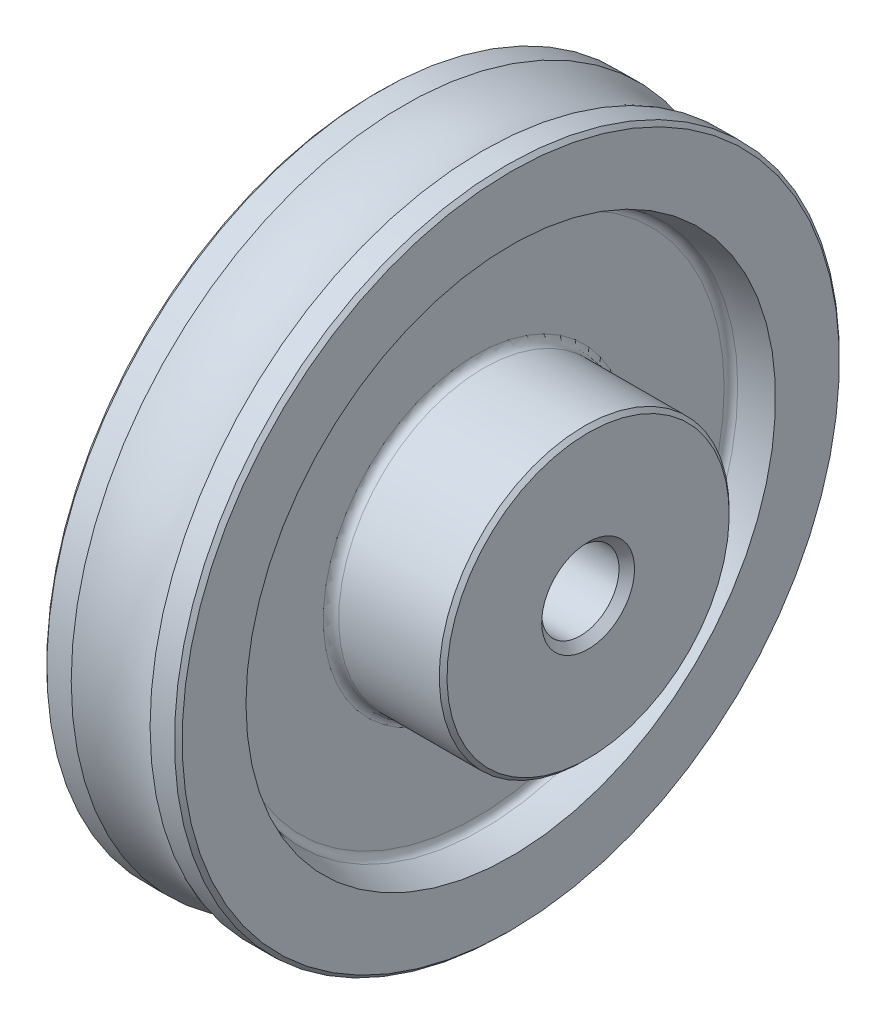
ISO-10303-21;
HEADER;
FILE_DESCRIPTION(('STEP AP214'),'2;1');
FILE_NAME('part.step','',(''),(''),'','','');
FILE_SCHEMA(('AUTOMOTIVE_DESIGN { 1 0 10303 214 1 1 1 1 }'));
ENDSEC;
DATA;
#1=APPLICATION_CONTEXT('core data for automotive mechanical design processes');
#2=APPLICATION_PROTOCOL_DEFINITION('international standard','automotive_design',2000,#1);
#3=PRODUCT_CONTEXT('',#1,'mechanical');
#4=PRODUCT('Part','Part','',(#3));
#5=PRODUCT_RELATED_PRODUCT_CATEGORY('part','',(#4));
#6=PRODUCT_DEFINITION_FORMATION('','',#4);
#7=PRODUCT_DEFINITION_CONTEXT('part definition',#1,'design');
#8=PRODUCT_DEFINITION('design','',#6,#7);
#9=PRODUCT_DEFINITION_SHAPE('','',#8);
#10=(LENGTH_UNIT() NAMED_UNIT(*) SI_UNIT(.MILLI.,.METRE.));
#11=(NAMED_UNIT(*) PLANE_ANGLE_UNIT() SI_UNIT($,.RADIAN.));
#12=(NAMED_UNIT(*) SI_UNIT($,.STERADIAN.) SOLID_ANGLE_UNIT());
#13=UNCERTAINTY_MEASURE_WITH_UNIT(LENGTH_MEASURE(1.E-05),#10,'distance_accuracy_value','');
#14=(GEOMETRIC_REPRESENTATION_CONTEXT(3) GLOBAL_UNCERTAINTY_ASSIGNED_CONTEXT((#13)) GLOBAL_UNIT_ASSIGNED_CONTEXT((#10,
#11,#12)) REPRESENTATION_CONTEXT('',''));
#15=CARTESIAN_POINT('',(0.,0.,0.));
#16=DIRECTION('',(0.,0.,1.));
#17=DIRECTION('',(1.,0.,0.));
#18=AXIS2_PLACEMENT_3D('',#15,#16,#17);
#19=CARTESIAN_POINT('',(-17.4999999999997,-1.22181724799905E-13,0.));
#20=DIRECTION('',(-1.,0.,0.));
#21=DIRECTION('',(0.,-1.,0.));
#22=AXIS2_PLACEMENT_3D('',#19,#20,#21);
#23=PLANE('',#22);
#24=CARTESIAN_POINT('',(-17.4999999999997,-1.22181724799905E-13,0.));
#25=DIRECTION('',(-1.,0.,0.));
#26=DIRECTION('',(0.,-1.,0.));
#27=AXIS2_PLACEMENT_3D('',#24,#25,#26);
#28=CIRCLE('',#27,84.9999999999998);
#29=CARTESIAN_POINT('',(-17.4999999999991,-84.9999999999999,0.));
#30=VERTEX_POINT('',#29);
#31=EDGE_CURVE('E81',#30,#30,#28,.T.);
#32=ORIENTED_EDGE('',*,*,#31,.T.);
#33=EDGE_LOOP('',(#32));
#34=FACE_BOUND('',#33,.T.);
#35=CARTESIAN_POINT('',(-17.5,0.,0.));
#36=DIRECTION('',(-1.,0.,0.));
#37=DIRECTION('',(0.,0.,1.));
#38=AXIS2_PLACEMENT_3D('',#35,#36,#37);
#39=CIRCLE('',#38,68.5);
#40=CARTESIAN_POINT('',(-17.5,0.,68.5));
#41=VERTEX_POINT('',#40);
#42=EDGE_CURVE('E111',#41,#41,#39,.T.);
#43=ORIENTED_EDGE('',*,*,#42,.F.);
#44=EDGE_LOOP('',(#43));
#45=FACE_BOUND('',#44,.T.);
#46=ADVANCED_FACE('F37',(#34,#45),#23,.T.);
#47=CARTESIAN_POINT('',(0.,0.,0.));
#48=DIRECTION('',(1.,0.,0.));
#49=DIRECTION('',(0.,1.,0.));
#50=AXIS2_PLACEMENT_3D('',#47,#48,#49);
#51=CYLINDRICAL_SURFACE('',#50,86.);
#52=CARTESIAN_POINT('',(16.5000000000004,1.151999119542E-13,0.));
#53=DIRECTION('',(1.,0.,0.));
#54=DIRECTION('',(0.,1.,0.));
#55=AXIS2_PLACEMENT_3D('',#52,#53,#54);
#56=CIRCLE('',#55,86.);
#57=CARTESIAN_POINT('',(16.4999999999998,86.0000000000001,0.));
#58=VERTEX_POINT('',#57);
#59=EDGE_CURVE('E87',#58,#58,#56,.F.);
#60=ORIENTED_EDGE('',*,*,#59,.T.);
#61=EDGE_LOOP('',(#60));
#62=FACE_BOUND('',#61,.T.);
#63=CARTESIAN_POINT('',(10.1980390271855,0.,0.));
#64=DIRECTION('',(-1.,0.,0.));
#65=DIRECTION('',(0.,0.,1.));
#66=AXIS2_PLACEMENT_3D('',#63,#64,#65);
#67=CIRCLE('',#66,86.);
#68=CARTESIAN_POINT('',(10.1980390271855,0.,86.));
#69=VERTEX_POINT('',#68);
#70=EDGE_CURVE('E105',#69,#69,#67,.T.);
#71=ORIENTED_EDGE('',*,*,#70,.F.);
#72=EDGE_LOOP('',(#71));
#73=FACE_BOUND('',#72,.T.);
#74=ADVANCED_FACE('F121',(#62,#73),#51,.T.);
#75=CARTESIAN_POINT('',(17.4999999999998,86.,0.));
#76=DIRECTION('',(1.,0.,0.));
#77=DIRECTION('',(0.,1.,0.));
#78=AXIS2_PLACEMENT_3D('',#75,#76,#77);
#79=PLANE('',#78);
#80=CARTESIAN_POINT('',(17.5000000000004,1.2218172479991E-13,0.));
#81=DIRECTION('',(1.,0.,0.));
#82=DIRECTION('',(0.,1.,0.));
#83=AXIS2_PLACEMENT_3D('',#80,#81,#82);
#84=CIRCLE('',#83,85.);
#85=CARTESIAN_POINT('',(17.4999999999998,85.0000000000001,0.));
#86=VERTEX_POINT('',#85);
#87=EDGE_CURVE('E90',#86,#86,#84,.T.);
#88=ORIENTED_EDGE('',*,*,#87,.T.);
#89=EDGE_LOOP('',(#88));
#90=FACE_BOUND('',#89,.T.);
#91=CARTESIAN_POINT('',(17.5000000000001,0.,0.));
#92=DIRECTION('',(-1.,0.,0.));
#93=DIRECTION('',(0.,0.,1.));
#94=AXIS2_PLACEMENT_3D('',#91,#92,#93);
#95=CIRCLE('',#94,68.5);
#96=CARTESIAN_POINT('',(17.5000000000001,0.,68.5));
#97=VERTEX_POINT('',#96);
#98=EDGE_CURVE('E112',#97,#97,#95,.T.);
#99=ORIENTED_EDGE('',*,*,#98,.T.);
#100=EDGE_LOOP('',(#99));
#101=FACE_BOUND('',#100,.T.);
#102=ADVANCED_FACE('F128',(#90,#101),#79,.T.);
#103=CARTESIAN_POINT('',(0.,0.,0.));
#104=DIRECTION('',(1.,0.,0.));
#105=DIRECTION('',(0.,0.,-1.));
#106=AXIS2_PLACEMENT_3D('',#103,#104,#105);
#107=TOROIDAL_SURFACE('',#106,111.,27.);
#108=ORIENTED_EDGE('',*,*,#70,.T.);
#109=EDGE_LOOP('',(#108));
#110=FACE_BOUND('',#109,.T.);
#111=CARTESIAN_POINT('',(-10.1980390271855,0.,0.));
#112=DIRECTION('',(1.,0.,0.));
#113=DIRECTION('',(0.,0.,-1.));
#114=AXIS2_PLACEMENT_3D('',#111,#112,#113);
#115=CIRCLE('',#114,86.);
#116=CARTESIAN_POINT('',(-10.1980390271855,0.,-86.));
#117=VERTEX_POINT('',#116);
#118=EDGE_CURVE('E108',#117,#117,#115,.T.);
#119=ORIENTED_EDGE('',*,*,#118,.T.);
#120=EDGE_LOOP('',(#119));
#121=FACE_BOUND('',#120,.T.);
#122=ADVANCED_FACE('F229',(#110,#121),#107,.F.);
#123=CARTESIAN_POINT('',(-16.4999999999995,-1.15199911954194E-13,0.));
#124=DIRECTION('',(-1.,0.,0.));
#125=DIRECTION('',(0.,-1.,0.));
#126=AXIS2_PLACEMENT_3D('',#123,#124,#125);
#127=CIRCLE('',#126,86.);
#128=CARTESIAN_POINT('',(-16.4999999999989,-86.0000000000001,0.));
#129=VERTEX_POINT('',#128);
#130=EDGE_CURVE('E84',#129,#129,#127,.F.);
#131=ORIENTED_EDGE('',*,*,#130,.T.);
#132=EDGE_LOOP('',(#131));
#133=FACE_BOUND('',#132,.T.);
#134=ORIENTED_EDGE('',*,*,#118,.F.);
#135=EDGE_LOOP('',(#134));
#136=FACE_BOUND('',#135,.T.);
#137=ADVANCED_FACE('F131',(#133,#136),#51,.T.);
#138=CARTESIAN_POINT('',(0.,0.,0.));
#139=DIRECTION('',(-1.,0.,0.));
#140=DIRECTION('',(0.,0.,1.));
#141=AXIS2_PLACEMENT_3D('',#138,#139,#140);
#142=TOROIDAL_SURFACE('',#141,111.,45.9619407771256);
#143=CARTESIAN_POINT('',(-10.0621528307709,0.,0.));
#144=DIRECTION('',(1.,0.,0.));
#145=DIRECTION('',(0.,0.,-1.));
#146=AXIS2_PLACEMENT_3D('',#143,#144,#145);
#147=CIRCLE('',#146,66.1530036634536);
#148=CARTESIAN_POINT('',(-10.0621528307709,0.,-66.1530036634536));
#149=VERTEX_POINT('',#148);
#150=EDGE_CURVE('E57',#149,#149,#147,.T.);
#151=ORIENTED_EDGE('',*,*,#150,.T.);
#152=EDGE_LOOP('',(#151));
#153=FACE_BOUND('',#152,.T.);
#154=ORIENTED_EDGE('',*,*,#42,.T.);
#155=EDGE_LOOP('',(#154));
#156=FACE_BOUND('',#155,.T.);
#157=ADVANCED_FACE('F118',(#153,#156),#142,.T.);
#158=CARTESIAN_POINT('',(-8.5,37.4999999999999,0.));
#159=DIRECTION('',(-1.,0.,0.));
#160=DIRECTION('',(0.,0.,1.));
#161=AXIS2_PLACEMENT_3D('',#158,#159,#160);
#162=PLANE('',#161);
#163=CARTESIAN_POINT('',(-8.5,0.,0.));
#164=DIRECTION('',(-1.,0.,0.));
#165=DIRECTION('',(0.,0.,1.));
#166=AXIS2_PLACEMENT_3D('',#163,#164,#165);
#167=CIRCLE('',#166,39.4999999999999);
#168=CARTESIAN_POINT('',(-8.5,0.,39.4999999999999));
#169=VERTEX_POINT('',#168);
#170=EDGE_CURVE('E10',#169,#169,#167,.F.);
#171=ORIENTED_EDGE('',*,*,#170,.T.);
#172=EDGE_LOOP('',(#171));
#173=FACE_BOUND('',#172,.T.);
#174=CARTESIAN_POINT('',(-8.5,0.,0.));
#175=DIRECTION('',(-1.,0.,0.));
#176=DIRECTION('',(0.,0.,1.));
#177=AXIS2_PLACEMENT_3D('',#174,#175,#176);
#178=CIRCLE('',#177,64.2015196495815);
#179=CARTESIAN_POINT('',(-8.5,0.,64.2015196495815));
#180=VERTEX_POINT('',#179);
#181=EDGE_CURVE('E60',#180,#180,#178,.T.);
#182=ORIENTED_EDGE('',*,*,#181,.T.);
#183=EDGE_LOOP('',(#182));
#184=FACE_BOUND('',#183,.T.);
#185=ADVANCED_FACE('F243',(#173,#184),#162,.T.);
#186=CARTESIAN_POINT('',(0.,0.,0.));
#187=DIRECTION('',(-1.,0.,0.));
#188=DIRECTION('',(0.,0.,1.));
#189=AXIS2_PLACEMENT_3D('',#186,#187,#188);
#190=CYLINDRICAL_SURFACE('',#189,37.4999999999999);
#191=CARTESIAN_POINT('',(-10.5,0.,0.));
#192=DIRECTION('',(-1.,0.,0.));
#193=DIRECTION('',(0.,0.,1.));
#194=AXIS2_PLACEMENT_3D('',#191,#192,#193);
#195=CIRCLE('',#194,37.4999999999999);
#196=CARTESIAN_POINT('',(-10.5,0.,37.4999999999999));
#197=VERTEX_POINT('',#196);
#198=EDGE_CURVE('E44',#197,#197,#195,.T.);
#199=ORIENTED_EDGE('',*,*,#198,.T.);
#200=EDGE_LOOP('',(#199));
#201=FACE_BOUND('',#200,.T.);
#202=CARTESIAN_POINT('',(-16.4999999999993,0.,0.));
#203=DIRECTION('',(-1.,0.,0.));
#204=DIRECTION('',(0.,0.,1.));
#205=AXIS2_PLACEMENT_3D('',#202,#203,#204);
#206=CIRCLE('',#205,37.4999999999999);
#207=CARTESIAN_POINT('',(-16.4999999999993,0.,37.4999999999999));
#208=VERTEX_POINT('',#207);
#209=EDGE_CURVE('E99',#208,#208,#206,.F.);
#210=ORIENTED_EDGE('',*,*,#209,.T.);
#211=EDGE_LOOP('',(#210));
#212=FACE_BOUND('',#211,.T.);
#213=ADVANCED_FACE('F220',(#201,#212),#190,.T.);
#214=CARTESIAN_POINT('',(8.49999999999966,37.4999999999999,0.));
#215=DIRECTION('',(1.,0.,0.));
#216=DIRECTION('',(0.,0.,-1.));
#217=AXIS2_PLACEMENT_3D('',#214,#215,#216);
#218=PLANE('',#217);
#219=CARTESIAN_POINT('',(8.49999999999966,0.,0.));
#220=DIRECTION('',(1.,0.,0.));
#221=DIRECTION('',(0.,0.,-1.));
#222=AXIS2_PLACEMENT_3D('',#219,#220,#221);
#223=CIRCLE('',#222,39.4999999999998);
#224=CARTESIAN_POINT('',(8.49999999999966,0.,-39.4999999999998));
#225=VERTEX_POINT('',#224);
#226=EDGE_CURVE('E52',#225,#225,#223,.F.);
#227=ORIENTED_EDGE('',*,*,#226,.T.);
#228=EDGE_LOOP('',(#227));
#229=FACE_BOUND('',#228,.T.);
#230=CARTESIAN_POINT('',(8.49999999999966,0.,0.));
#231=DIRECTION('',(1.,0.,0.));
#232=DIRECTION('',(0.,0.,-1.));
#233=AXIS2_PLACEMENT_3D('',#230,#231,#232);
#234=CIRCLE('',#233,64.2015196495815);
#235=CARTESIAN_POINT('',(8.49999999999966,0.,-64.2015196495815));
#236=VERTEX_POINT('',#235);
#237=EDGE_CURVE('E63',#236,#236,#234,.T.);
#238=ORIENTED_EDGE('',*,*,#237,.T.);
#239=EDGE_LOOP('',(#238));
#240=FACE_BOUND('',#239,.T.);
#241=ADVANCED_FACE('F144',(#229,#240),#218,.T.);
#242=CARTESIAN_POINT('',(0.,0.,0.));
#243=DIRECTION('',(-1.,0.,0.));
#244=DIRECTION('',(0.,0.,1.));
#245=AXIS2_PLACEMENT_3D('',#242,#243,#244);
#246=TOROIDAL_SURFACE('',#245,111.,45.9619407771256);
#247=CARTESIAN_POINT('',(10.0621528307705,0.,0.));
#248=DIRECTION('',(-1.,0.,0.));
#249=DIRECTION('',(0.,0.,1.));
#250=AXIS2_PLACEMENT_3D('',#247,#248,#249);
#251=CIRCLE('',#250,66.1530036634535);
#252=CARTESIAN_POINT('',(10.0621528307705,0.,66.1530036634535));
#253=VERTEX_POINT('',#252);
#254=EDGE_CURVE('E66',#253,#253,#251,.T.);
#255=ORIENTED_EDGE('',*,*,#254,.T.);
#256=EDGE_LOOP('',(#255));
#257=FACE_BOUND('',#256,.T.);
#258=ORIENTED_EDGE('',*,*,#98,.F.);
#259=EDGE_LOOP('',(#258));
#260=FACE_BOUND('',#259,.T.);
#261=ADVANCED_FACE('F135',(#257,#260),#246,.T.);
#262=CARTESIAN_POINT('',(-17.4999999999997,-4.8377844246308E-13,0.));
#263=DIRECTION('',(-1.,0.,0.));
#264=DIRECTION('',(0.,-1.,0.));
#265=AXIS2_PLACEMENT_3D('',#262,#263,#264);
#266=CIRCLE('',#265,11.999999999999);
#267=CARTESIAN_POINT('',(-17.4999999999996,-11.9999999999995,0.));
#268=VERTEX_POINT('',#267);
#269=EDGE_CURVE('E78',#268,#268,#266,.F.);
#270=ORIENTED_EDGE('',*,*,#269,.T.);
#271=EDGE_LOOP('',(#270));
#272=FACE_BOUND('',#271,.T.);
#273=CARTESIAN_POINT('',(-17.4999999999997,0.,0.));
#274=DIRECTION('',(-1.,0.,0.));
#275=DIRECTION('',(0.,-1.,0.));
#276=AXIS2_PLACEMENT_3D('',#273,#274,#275);
#277=CIRCLE('',#276,36.4999999999995);
#278=CARTESIAN_POINT('',(-17.4999999999994,-36.4999999999995,0.));
#279=VERTEX_POINT('',#278);
#280=EDGE_CURVE('E102',#279,#279,#277,.T.);
#281=ORIENTED_EDGE('',*,*,#280,.T.);
#282=EDGE_LOOP('',(#281));
#283=FACE_BOUND('',#282,.T.);
#284=ADVANCED_FACE('F124',(#272,#283),#23,.T.);
#285=CARTESIAN_POINT('',(37.4999999999999,37.5,0.));
#286=DIRECTION('',(1.,0.,0.));
#287=DIRECTION('',(0.,1.,0.));
#288=AXIS2_PLACEMENT_3D('',#285,#286,#287);
#289=PLANE('',#288);
#290=CARTESIAN_POINT('',(37.5000000000001,0.,0.));
#291=DIRECTION('',(1.,0.,0.));
#292=DIRECTION('',(0.,1.,0.));
#293=AXIS2_PLACEMENT_3D('',#290,#291,#292);
#294=CIRCLE('',#293,12.0000000000001);
#295=CARTESIAN_POINT('',(37.5000000000001,12.,0.));
#296=VERTEX_POINT('',#295);
#297=EDGE_CURVE('E69',#296,#296,#294,.F.);
#298=ORIENTED_EDGE('',*,*,#297,.T.);
#299=EDGE_LOOP('',(#298));
#300=FACE_BOUND('',#299,.T.);
#301=CARTESIAN_POINT('',(37.5000000000001,2.61817981714087E-13,0.));
#302=DIRECTION('',(1.,0.,0.));
#303=DIRECTION('',(0.,1.,0.));
#304=AXIS2_PLACEMENT_3D('',#301,#302,#303);
#305=CIRCLE('',#304,36.4999999999999);
#306=CARTESIAN_POINT('',(37.4999999999999,36.5000000000001,0.));
#307=VERTEX_POINT('',#306);
#308=EDGE_CURVE('E96',#307,#307,#305,.T.);
#309=ORIENTED_EDGE('',*,*,#308,.T.);
#310=EDGE_LOOP('',(#309));
#311=FACE_BOUND('',#310,.T.);
#312=ADVANCED_FACE('F134',(#300,#311),#289,.T.);
#313=CARTESIAN_POINT('',(0.,0.,0.));
#314=DIRECTION('',(1.,0.,0.));
#315=DIRECTION('',(0.,1.,0.));
#316=AXIS2_PLACEMENT_3D('',#313,#314,#315);
#317=CYLINDRICAL_SURFACE('',#316,37.4999999999998);
#318=CARTESIAN_POINT('',(10.4999999999997,0.,0.));
#319=DIRECTION('',(1.,0.,0.));
#320=DIRECTION('',(0.,0.,-1.));
#321=AXIS2_PLACEMENT_3D('',#318,#319,#320);
#322=CIRCLE('',#321,37.4999999999998);
#323=CARTESIAN_POINT('',(10.4999999999997,0.,-37.4999999999998));
#324=VERTEX_POINT('',#323);
#325=EDGE_CURVE('E48',#324,#324,#322,.T.);
#326=ORIENTED_EDGE('',*,*,#325,.T.);
#327=EDGE_LOOP('',(#326));
#328=FACE_BOUND('',#327,.T.);
#329=CARTESIAN_POINT('',(36.5000000000002,2.54836168868378E-13,0.));
#330=DIRECTION('',(1.,0.,0.));
#331=DIRECTION('',(0.,1.,0.));
#332=AXIS2_PLACEMENT_3D('',#329,#330,#331);
#333=CIRCLE('',#332,37.4999999999998);
#334=CARTESIAN_POINT('',(36.4999999999999,37.5000000000001,0.));
#335=VERTEX_POINT('',#334);
#336=EDGE_CURVE('E93',#335,#335,#333,.F.);
#337=ORIENTED_EDGE('',*,*,#336,.T.);
#338=EDGE_LOOP('',(#337));
#339=FACE_BOUND('',#338,.T.);
#340=ADVANCED_FACE('F141',(#328,#339),#317,.T.);
#341=CARTESIAN_POINT('',(-17.5000000000006,-4.83778442463086E-13,0.));
#342=DIRECTION('',(1.,0.,0.));
#343=DIRECTION('',(0.,1.,0.));
#344=AXIS2_PLACEMENT_3D('',#341,#342,#343);
#345=CYLINDRICAL_SURFACE('',#344,10.);
#346=CARTESIAN_POINT('',(-15.5000000000007,-4.69814816771669E-13,0.));
#347=DIRECTION('',(-1.,0.,0.));
#348=DIRECTION('',(0.,-1.,0.));
#349=AXIS2_PLACEMENT_3D('',#346,#347,#348);
#350=CIRCLE('',#349,10.);
#351=CARTESIAN_POINT('',(-15.5000000000007,9.99999999999953,0.));
#352=VERTEX_POINT('',#351);
#353=EDGE_CURVE('E72',#352,#352,#350,.T.);
#354=CARTESIAN_POINT('',(35.5,-1.13742361640507E-13,0.));
#355=DIRECTION('',(1.,0.,0.));
#356=DIRECTION('',(0.,1.,0.));
#357=AXIS2_PLACEMENT_3D('',#354,#355,#356);
#358=CIRCLE('',#357,10.);
#359=CARTESIAN_POINT('',(35.5,9.99999999999989,0.));
#360=VERTEX_POINT('',#359);
#361=EDGE_CURVE('E75',#360,#360,#358,.T.);
#362=CARTESIAN_POINT('',(-15.5000000000007,9.99999999999953,0.));
#363=CARTESIAN_POINT('',(-14.9687500000007,9.99999999999953,0.));
#364=CARTESIAN_POINT('',(-14.4375000000007,9.99999999999954,0.));
#365=CARTESIAN_POINT('',(-13.3750000000007,9.99999999999954,0.));
#366=CARTESIAN_POINT('',(-12.8437500000007,9.99999999999955,0.));
#367=CARTESIAN_POINT('',(-11.7812500000007,9.99999999999956,0.));
#368=CARTESIAN_POINT('',(-11.2500000000007,9.99999999999956,0.));
#369=CARTESIAN_POINT('',(-10.1875000000007,9.99999999999957,0.));
#370=CARTESIAN_POINT('',(-9.65625000000066,9.99999999999957,0.));
#371=CARTESIAN_POINT('',(-8.59375000000064,9.99999999999958,0.));
#372=CARTESIAN_POINT('',(-8.06250000000064,9.99999999999958,0.));
#373=CARTESIAN_POINT('',(-7.00000000000062,9.99999999999959,0.));
#374=CARTESIAN_POINT('',(-6.46875000000061,9.99999999999959,0.));
#375=CARTESIAN_POINT('',(-5.4062500000006,9.9999999999996,0.));
#376=CARTESIAN_POINT('',(-4.87500000000059,9.9999999999996,0.));
#377=CARTESIAN_POINT('',(-3.81250000000058,9.99999999999961,0.));
#378=CARTESIAN_POINT('',(-3.28125000000057,9.99999999999961,0.));
#379=CARTESIAN_POINT('',(-2.21875000000056,9.99999999999962,0.));
#380=CARTESIAN_POINT('',(-1.68750000000055,9.99999999999963,0.));
#381=CARTESIAN_POINT('',(-0.625000000000535,9.99999999999963,0.));
#382=CARTESIAN_POINT('',(-0.0937500000005274,9.99999999999964,0.));
#383=CARTESIAN_POINT('',(0.968749999999487,9.99999999999964,0.));
#384=CARTESIAN_POINT('',(1.4999999999995,9.99999999999965,0.));
#385=CARTESIAN_POINT('',(2.56249999999951,9.99999999999966,0.));
#386=CARTESIAN_POINT('',(3.09374999999952,9.99999999999966,0.));
#387=CARTESIAN_POINT('',(4.15624999999953,9.99999999999967,0.));
#388=CARTESIAN_POINT('',(4.68749999999954,9.99999999999967,0.));
#389=CARTESIAN_POINT('',(5.74999999999955,9.99999999999968,0.));
#390=CARTESIAN_POINT('',(6.28124999999956,9.99999999999968,0.));
#391=CARTESIAN_POINT('',(7.34374999999958,9.99999999999969,0.));
#392=CARTESIAN_POINT('',(7.87499999999958,9.99999999999969,0.));
#393=CARTESIAN_POINT('',(8.9374999999996,9.9999999999997,0.));
#394=CARTESIAN_POINT('',(9.46874999999961,9.99999999999971,0.));
#395=CARTESIAN_POINT('',(10.5312499999996,9.99999999999971,0.));
#396=CARTESIAN_POINT('',(11.0624999999996,9.99999999999972,0.));
#397=CARTESIAN_POINT('',(12.1249999999996,9.99999999999972,0.));
#398=CARTESIAN_POINT('',(12.6562499999997,9.99999999999973,0.));
#399=CARTESIAN_POINT('',(13.7187499999997,9.99999999999974,0.));
#400=CARTESIAN_POINT('',(14.2499999999997,9.99999999999974,0.));
#401=CARTESIAN_POINT('',(15.3124999999997,9.99999999999975,0.));
#402=CARTESIAN_POINT('',(15.8437499999997,9.99999999999975,0.));
#403=CARTESIAN_POINT('',(16.9062499999997,9.99999999999975,0.));
#404=CARTESIAN_POINT('',(17.4374999999997,9.99999999999976,0.));
#405=CARTESIAN_POINT('',(18.4999999999997,9.99999999999977,0.));
#406=CARTESIAN_POINT('',(19.0312499999997,9.99999999999977,0.));
#407=CARTESIAN_POINT('',(20.0937499999997,9.99999999999978,0.));
#408=CARTESIAN_POINT('',(20.6249999999998,9.99999999999978,0.));
#409=CARTESIAN_POINT('',(21.6874999999998,9.99999999999979,0.));
#410=CARTESIAN_POINT('',(22.2187499999998,9.99999999999979,0.));
#411=CARTESIAN_POINT('',(23.2812499999998,9.9999999999998,0.));
#412=CARTESIAN_POINT('',(23.8124999999998,9.9999999999998,0.));
#413=CARTESIAN_POINT('',(24.8749999999998,9.99999999999981,0.));
#414=CARTESIAN_POINT('',(25.4062499999998,9.99999999999982,0.));
#415=CARTESIAN_POINT('',(26.4687499999998,9.99999999999982,0.));
#416=CARTESIAN_POINT('',(26.9999999999998,9.99999999999983,0.));
#417=CARTESIAN_POINT('',(28.0624999999999,9.99999999999983,0.));
#418=CARTESIAN_POINT('',(28.5937499999999,9.99999999999984,0.));
#419=CARTESIAN_POINT('',(29.6562499999999,9.99999999999985,0.));
#420=CARTESIAN_POINT('',(30.1874999999999,9.99999999999985,0.));
#421=CARTESIAN_POINT('',(31.2499999999999,9.99999999999986,0.));
#422=CARTESIAN_POINT('',(31.7812499999999,9.99999999999986,0.));
#423=CARTESIAN_POINT('',(32.8437499999999,9.99999999999987,0.));
#424=CARTESIAN_POINT('',(33.3749999999999,9.99999999999987,0.));
#425=CARTESIAN_POINT('',(34.4375,9.99999999999988,0.));
#426=CARTESIAN_POINT('',(34.96875,9.99999999999988,0.));
#427=CARTESIAN_POINT('',(35.5,9.99999999999989,0.));
#428=B_SPLINE_CURVE_WITH_KNOTS('',3,(#362,#363,#364,#365,#366,#367,#368,#369,#370,#371,#372,
#373,#374,#375,#376,#377,#378,#379,#380,#381,#382,#383,#384,#385,#386,#387,#388,#389,#390,#391,
#392,#393,#394,#395,#396,#397,#398,#399,#400,#401,#402,#403,#404,#405,#406,#407,#408,#409,#410,
#411,#412,#413,#414,#415,#416,#417,#418,#419,#420,#421,#422,#423,#424,#425,#426,#427),
.UNSPECIFIED.,.F.,.F.,(4,2,2,2,2,2,2,2,2,2,2,2,2,2,2,2,2,2,2,2,2,2,2,2,2,2,2,2,2,2,2,2,4),(0.,
1.59375000000002,3.18750000000004,4.78125000000007,6.37500000000009,7.96875000000011,
9.56250000000013,11.1562500000002,12.7500000000002,14.3437500000002,15.9375000000002,
17.5312500000002,19.1250000000003,20.7187500000003,22.3125000000003,23.9062500000003,
25.5000000000004,27.0937500000004,28.6875000000004,30.2812500000004,31.8750000000004,
33.4687500000005,35.0625000000005,36.6562500000005,38.2500000000005,39.8437500000005,
41.4375000000006,43.0312500000006,44.6250000000006,46.2187500000006,47.8125000000007,
49.4062500000007,51.0000000000007),.UNSPECIFIED.);
#429=EDGE_CURVE('BSEAM154',#352,#360,#428,.T.);
#430=ORIENTED_EDGE('',*,*,#353,.T.);
#431=ORIENTED_EDGE('',*,*,#361,.T.);
#432=ORIENTED_EDGE('',*,*,#429,.T.);
#433=ORIENTED_EDGE('',*,*,#429,.F.);
#434=EDGE_LOOP('',(#430,#432,#431,#433));
#435=FACE_BOUND('',#434,.T.);
#436=ADVANCED_FACE('F154',(#435),#345,.F.);
#437=CARTESIAN_POINT('',(-17.4999999999997,0.,0.));
#438=DIRECTION('',(1.,0.,0.));
#439=DIRECTION('',(0.,0.,-1.));
#440=AXIS2_PLACEMENT_3D('',#437,#438,#439);
#441=CONICAL_SURFACE('',#440,36.4999999999995,0.785398163397445);
#442=ORIENTED_EDGE('',*,*,#209,.F.);
#443=EDGE_LOOP('',(#442));
#444=FACE_BOUND('',#443,.T.);
#445=ORIENTED_EDGE('',*,*,#280,.F.);
#446=EDGE_LOOP('',(#445));
#447=FACE_BOUND('',#446,.T.);
#448=ADVANCED_FACE('F151',(#444,#447),#441,.T.);
#449=CARTESIAN_POINT('',(37.5000000000001,2.61817981714087E-13,0.));
#450=DIRECTION('',(-1.,0.,0.));
#451=DIRECTION('',(0.,-1.,0.));
#452=AXIS2_PLACEMENT_3D('',#449,#450,#451);
#453=CONICAL_SURFACE('',#452,36.4999999999999,0.785398163397431);
#454=ORIENTED_EDGE('',*,*,#336,.F.);
#455=EDGE_LOOP('',(#454));
#456=FACE_BOUND('',#455,.T.);
#457=ORIENTED_EDGE('',*,*,#308,.F.);
#458=EDGE_LOOP('',(#457));
#459=FACE_BOUND('',#458,.T.);
#460=ADVANCED_FACE('F153',(#456,#459),#453,.T.);
#461=CARTESIAN_POINT('',(17.5000000000004,1.2218172479991E-13,0.));
#462=DIRECTION('',(-1.,0.,0.));
#463=DIRECTION('',(0.,-1.,0.));
#464=AXIS2_PLACEMENT_3D('',#461,#462,#463);
#465=CONICAL_SURFACE('',#464,85.,0.785398163397431);
#466=ORIENTED_EDGE('',*,*,#59,.F.);
#467=EDGE_LOOP('',(#466));
#468=FACE_BOUND('',#467,.T.);
#469=ORIENTED_EDGE('',*,*,#87,.F.);
#470=EDGE_LOOP('',(#469));
#471=FACE_BOUND('',#470,.T.);
#472=ADVANCED_FACE('F160',(#468,#471),#465,.T.);
#473=CARTESIAN_POINT('',(-16.4999999999995,-1.15199911954194E-13,0.));
#474=DIRECTION('',(1.,0.,0.));
#475=DIRECTION('',(0.,1.,0.));
#476=AXIS2_PLACEMENT_3D('',#473,#474,#475);
#477=CONICAL_SURFACE('',#476,86.,0.785398163397452);
#478=ORIENTED_EDGE('',*,*,#31,.F.);
#479=EDGE_LOOP('',(#478));
#480=FACE_BOUND('',#479,.T.);
#481=ORIENTED_EDGE('',*,*,#130,.F.);
#482=EDGE_LOOP('',(#481));
#483=FACE_BOUND('',#482,.T.);
#484=ADVANCED_FACE('F179',(#480,#483),#477,.T.);
#485=CARTESIAN_POINT('',(-17.4999999999997,-4.8377844246308E-13,0.));
#486=DIRECTION('',(-1.,0.,0.));
#487=DIRECTION('',(0.,-1.,0.));
#488=AXIS2_PLACEMENT_3D('',#485,#486,#487);
#489=CONICAL_SURFACE('',#488,11.999999999999,0.785398163397443);
#490=ORIENTED_EDGE('',*,*,#353,.F.);
#491=EDGE_LOOP('',(#490));
#492=FACE_BOUND('',#491,.T.);
#493=ORIENTED_EDGE('',*,*,#269,.F.);
#494=EDGE_LOOP('',(#493));
#495=FACE_BOUND('',#494,.T.);
#496=ADVANCED_FACE('F186',(#492,#495),#489,.F.);
#497=CARTESIAN_POINT('',(35.5,-1.13742361640507E-13,0.));
#498=DIRECTION('',(1.,0.,0.));
#499=DIRECTION('',(0.,1.,0.));
#500=AXIS2_PLACEMENT_3D('',#497,#498,#499);
#501=CONICAL_SURFACE('',#500,10.,0.785398163397447);
#502=ORIENTED_EDGE('',*,*,#297,.F.);
#503=EDGE_LOOP('',(#502));
#504=FACE_BOUND('',#503,.T.);
#505=ORIENTED_EDGE('',*,*,#361,.F.);
#506=EDGE_LOOP('',(#505));
#507=FACE_BOUND('',#506,.T.);
#508=ADVANCED_FACE('F193',(#504,#507),#501,.F.);
#509=CARTESIAN_POINT('',(10.4999999999997,0.,0.));
#510=DIRECTION('',(-1.,0.,0.));
#511=DIRECTION('',(0.,0.,1.));
#512=AXIS2_PLACEMENT_3D('',#509,#510,#511);
#513=TOROIDAL_SURFACE('',#512,64.2015196495815,2.);
#514=ORIENTED_EDGE('',*,*,#237,.F.);
#515=EDGE_LOOP('',(#514));
#516=FACE_BOUND('',#515,.T.);
#517=ORIENTED_EDGE('',*,*,#254,.F.);
#518=EDGE_LOOP('',(#517));
#519=FACE_BOUND('',#518,.T.);
#520=ADVANCED_FACE('F199',(#516,#519),#513,.F.);
#521=CARTESIAN_POINT('',(-10.5,0.,0.));
#522=DIRECTION('',(1.,0.,0.));
#523=DIRECTION('',(0.,0.,-1.));
#524=AXIS2_PLACEMENT_3D('',#521,#522,#523);
#525=TOROIDAL_SURFACE('',#524,64.2015196495815,2.);
#526=ORIENTED_EDGE('',*,*,#150,.F.);
#527=EDGE_LOOP('',(#526));
#528=FACE_BOUND('',#527,.T.);
#529=ORIENTED_EDGE('',*,*,#181,.F.);
#530=EDGE_LOOP('',(#529));
#531=FACE_BOUND('',#530,.T.);
#532=ADVANCED_FACE('F203',(#528,#531),#525,.F.);
#533=CARTESIAN_POINT('',(10.4999999999997,0.,0.));
#534=DIRECTION('',(1.,0.,0.));
#535=DIRECTION('',(0.,0.,-1.));
#536=AXIS2_PLACEMENT_3D('',#533,#534,#535);
#537=TOROIDAL_SURFACE('',#536,39.4999999999998,2.);
#538=ORIENTED_EDGE('',*,*,#325,.F.);
#539=EDGE_LOOP('',(#538));
#540=FACE_BOUND('',#539,.T.);
#541=ORIENTED_EDGE('',*,*,#226,.F.);
#542=EDGE_LOOP('',(#541));
#543=FACE_BOUND('',#542,.T.);
#544=ADVANCED_FACE('F206',(#540,#543),#537,.F.);
#545=CARTESIAN_POINT('',(-10.5,0.,0.));
#546=DIRECTION('',(-1.,0.,0.));
#547=DIRECTION('',(0.,0.,1.));
#548=AXIS2_PLACEMENT_3D('',#545,#546,#547);
#549=TOROIDAL_SURFACE('',#548,39.4999999999999,2.);
#550=ORIENTED_EDGE('',*,*,#170,.F.);
#551=EDGE_LOOP('',(#550));
#552=FACE_BOUND('',#551,.T.);
#553=ORIENTED_EDGE('',*,*,#198,.F.);
#554=EDGE_LOOP('',(#553));
#555=FACE_BOUND('',#554,.T.);
#556=ADVANCED_FACE('F39',(#552,#555),#549,.F.);
#557=CLOSED_SHELL('',(#46,#74,#102,#122,#137,#157,#185,#213,#241,#261,#284,#312,#340,#436,#448,
#460,#472,#484,#496,#508,#520,#532,#544,#556));
#558=MANIFOLD_SOLID_BREP('B2',#557);
#559=ADVANCED_BREP_SHAPE_REPRESENTATION('',(#18,#558),#14);
#560=SHAPE_DEFINITION_REPRESENTATION(#9,#559);
ENDSEC;
END-ISO-10303-21;
